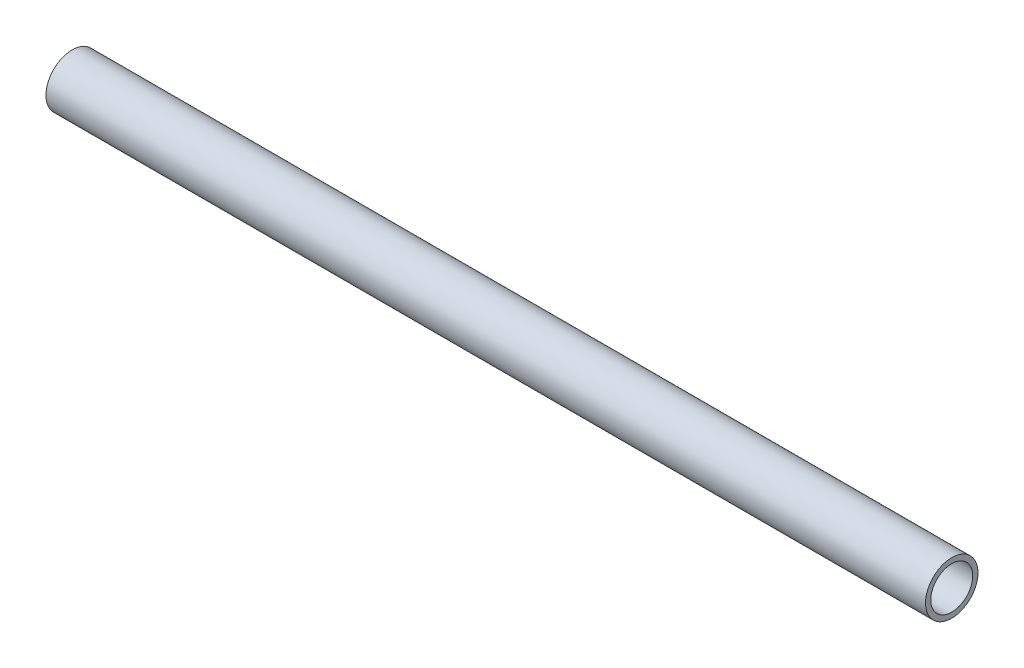
ISO-10303-21;
HEADER;
FILE_DESCRIPTION(('STEP AP214'),'2;1');
FILE_NAME('part.step','',(''),(''),'','','');
FILE_SCHEMA(('AUTOMOTIVE_DESIGN { 1 0 10303 214 1 1 1 1 }'));
ENDSEC;
DATA;
#1=APPLICATION_CONTEXT('core data for automotive mechanical design processes');
#2=APPLICATION_PROTOCOL_DEFINITION('international standard','automotive_design',2000,#1);
#3=PRODUCT_CONTEXT('',#1,'mechanical');
#4=PRODUCT('Part','Part','',(#3));
#5=PRODUCT_RELATED_PRODUCT_CATEGORY('part','',(#4));
#6=PRODUCT_DEFINITION_FORMATION('','',#4);
#7=PRODUCT_DEFINITION_CONTEXT('part definition',#1,'design');
#8=PRODUCT_DEFINITION('design','',#6,#7);
#9=PRODUCT_DEFINITION_SHAPE('','',#8);
#10=(LENGTH_UNIT() NAMED_UNIT(*) SI_UNIT(.MILLI.,.METRE.));
#11=(NAMED_UNIT(*) PLANE_ANGLE_UNIT() SI_UNIT($,.RADIAN.));
#12=(NAMED_UNIT(*) SI_UNIT($,.STERADIAN.) SOLID_ANGLE_UNIT());
#13=UNCERTAINTY_MEASURE_WITH_UNIT(LENGTH_MEASURE(1.E-05),#10,'distance_accuracy_value','');
#14=(GEOMETRIC_REPRESENTATION_CONTEXT(3) GLOBAL_UNCERTAINTY_ASSIGNED_CONTEXT((#13)) GLOBAL_UNIT_ASSIGNED_CONTEXT((#10,
#11,#12)) REPRESENTATION_CONTEXT('',''));
#15=CARTESIAN_POINT('',(0.,0.,0.));
#16=DIRECTION('',(0.,0.,1.));
#17=DIRECTION('',(1.,0.,0.));
#18=AXIS2_PLACEMENT_3D('',#15,#16,#17);
#19=CARTESIAN_POINT('',(-179.381625441696,-10.6625441696113,0.));
#20=DIRECTION('',(1.,0.,0.));
#21=DIRECTION('',(0.,0.,-1.));
#22=AXIS2_PLACEMENT_3D('',#19,#20,#21);
#23=PLANE('',#22);
#24=CARTESIAN_POINT('',(-179.381625441696,-10.6625441696113,0.));
#25=DIRECTION('',(1.,0.,0.));
#26=DIRECTION('',(0.,0.,-1.));
#27=AXIS2_PLACEMENT_3D('',#24,#25,#26);
#28=CIRCLE('',#27,8.);
#29=CARTESIAN_POINT('',(-179.381625441696,-10.6625441696113,-8.));
#30=VERTEX_POINT('',#29);
#31=EDGE_CURVE('E52',#30,#30,#28,.T.);
#32=ORIENTED_EDGE('',*,*,#31,.T.);
#33=EDGE_LOOP('',(#32));
#34=FACE_BOUND('',#33,.T.);
#35=CARTESIAN_POINT('',(-179.381625441696,-10.6625441696113,0.));
#36=DIRECTION('',(1.,0.,0.));
#37=DIRECTION('',(0.,0.,-1.));
#38=AXIS2_PLACEMENT_3D('',#35,#36,#37);
#39=CIRCLE('',#38,10.);
#40=CARTESIAN_POINT('',(-179.381625441696,-10.6625441696113,-10.));
#41=VERTEX_POINT('',#40);
#42=EDGE_CURVE('E41',#41,#41,#39,.T.);
#43=ORIENTED_EDGE('',*,*,#42,.F.);
#44=EDGE_LOOP('',(#43));
#45=FACE_BOUND('',#44,.T.);
#46=ADVANCED_FACE('F37',(#34,#45),#23,.F.);
#47=CARTESIAN_POINT('',(155.618374558304,-10.6625441696113,0.));
#48=DIRECTION('',(1.,0.,0.));
#49=DIRECTION('',(0.,0.,-1.));
#50=AXIS2_PLACEMENT_3D('',#47,#48,#49);
#51=PLANE('',#50);
#52=CARTESIAN_POINT('',(155.618374558304,-10.6625441696113,0.));
#53=DIRECTION('',(1.,0.,0.));
#54=DIRECTION('',(0.,0.,-1.));
#55=AXIS2_PLACEMENT_3D('',#52,#53,#54);
#56=CIRCLE('',#55,8.);
#57=CARTESIAN_POINT('',(155.618374558304,-10.6625441696113,-8.));
#58=VERTEX_POINT('',#57);
#59=EDGE_CURVE('E48',#58,#58,#56,.T.);
#60=ORIENTED_EDGE('',*,*,#59,.F.);
#61=EDGE_LOOP('',(#60));
#62=FACE_BOUND('',#61,.T.);
#63=CARTESIAN_POINT('',(155.618374558304,-10.6625441696113,0.));
#64=DIRECTION('',(1.,0.,0.));
#65=DIRECTION('',(0.,0.,-1.));
#66=AXIS2_PLACEMENT_3D('',#63,#64,#65);
#67=CIRCLE('',#66,10.);
#68=CARTESIAN_POINT('',(155.618374558304,-10.6625441696113,-10.));
#69=VERTEX_POINT('',#68);
#70=EDGE_CURVE('E11',#69,#69,#67,.T.);
#71=ORIENTED_EDGE('',*,*,#70,.T.);
#72=EDGE_LOOP('',(#71));
#73=FACE_BOUND('',#72,.T.);
#74=ADVANCED_FACE('F65',(#62,#73),#51,.T.);
#75=CARTESIAN_POINT('',(-179.381625441696,-10.6625441696113,0.));
#76=DIRECTION('',(1.,0.,0.));
#77=DIRECTION('',(0.,0.,-1.));
#78=AXIS2_PLACEMENT_3D('',#75,#76,#77);
#79=CYLINDRICAL_SURFACE('',#78,10.);
#80=ORIENTED_EDGE('',*,*,#70,.F.);
#81=EDGE_LOOP('',(#80));
#82=FACE_BOUND('',#81,.T.);
#83=ORIENTED_EDGE('',*,*,#42,.T.);
#84=EDGE_LOOP('',(#83));
#85=FACE_BOUND('',#84,.T.);
#86=ADVANCED_FACE('F39',(#82,#85),#79,.T.);
#87=CARTESIAN_POINT('',(-179.381625441696,-10.6625441696113,0.));
#88=DIRECTION('',(1.,0.,0.));
#89=DIRECTION('',(0.,0.,-1.));
#90=AXIS2_PLACEMENT_3D('',#87,#88,#89);
#91=CYLINDRICAL_SURFACE('',#90,8.);
#92=ORIENTED_EDGE('',*,*,#59,.T.);
#93=EDGE_LOOP('',(#92));
#94=FACE_BOUND('',#93,.T.);
#95=ORIENTED_EDGE('',*,*,#31,.F.);
#96=EDGE_LOOP('',(#95));
#97=FACE_BOUND('',#96,.T.);
#98=ADVANCED_FACE('F58',(#94,#97),#91,.F.);
#99=CLOSED_SHELL('',(#46,#74,#86,#98));
#100=MANIFOLD_SOLID_BREP('B2',#99);
#101=ADVANCED_BREP_SHAPE_REPRESENTATION('',(#18,#100),#14);
#102=SHAPE_DEFINITION_REPRESENTATION(#9,#101);
ENDSEC;
END-ISO-10303-21;
